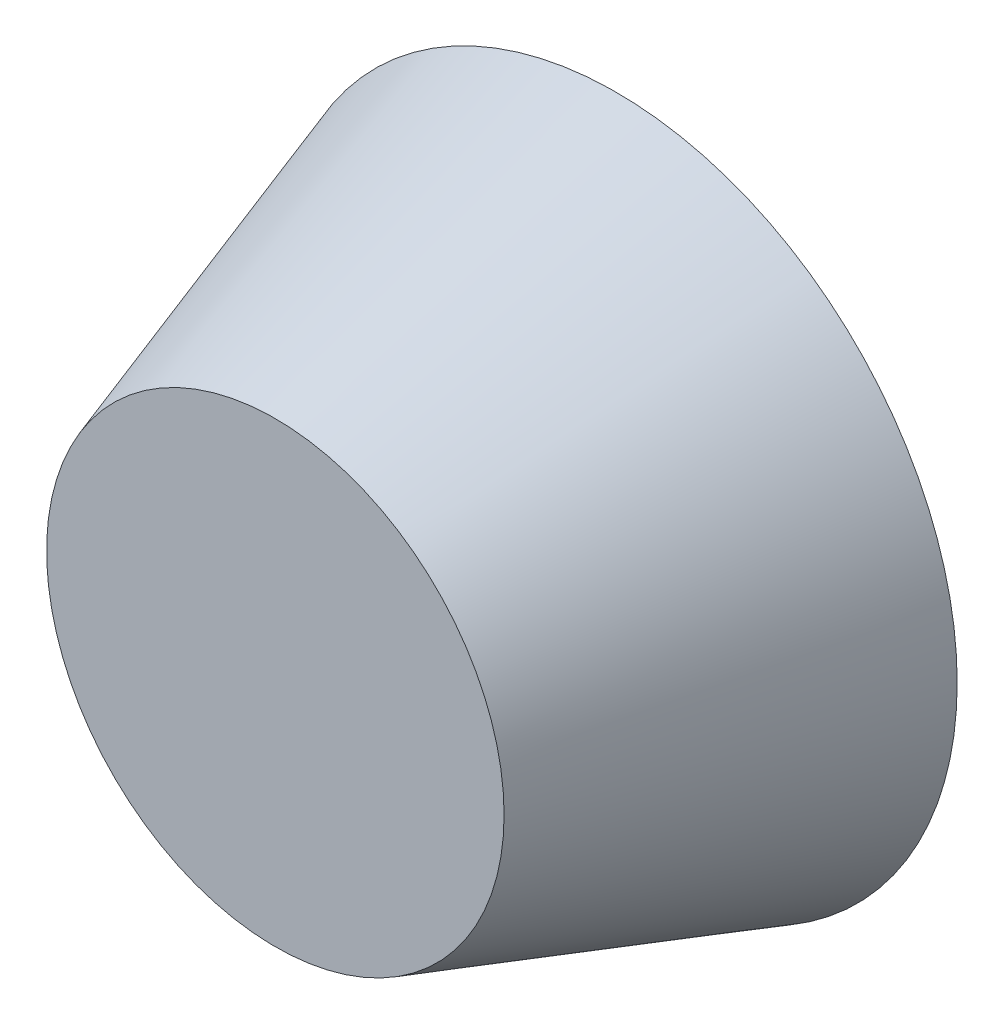
ISO-10303-21;
HEADER;
FILE_DESCRIPTION(('STEP AP214'),'2;1');
FILE_NAME('part.step','',(''),(''),'','','');
FILE_SCHEMA(('AUTOMOTIVE_DESIGN { 1 0 10303 214 1 1 1 1 }'));
ENDSEC;
DATA;
#1=APPLICATION_CONTEXT('core data for automotive mechanical design processes');
#2=APPLICATION_PROTOCOL_DEFINITION('international standard','automotive_design',2000,#1);
#3=PRODUCT_CONTEXT('',#1,'mechanical');
#4=PRODUCT('Part','Part','',(#3));
#5=PRODUCT_RELATED_PRODUCT_CATEGORY('part','',(#4));
#6=PRODUCT_DEFINITION_FORMATION('','',#4);
#7=PRODUCT_DEFINITION_CONTEXT('part definition',#1,'design');
#8=PRODUCT_DEFINITION('design','',#6,#7);
#9=PRODUCT_DEFINITION_SHAPE('','',#8);
#10=(LENGTH_UNIT() NAMED_UNIT(*) SI_UNIT(.MILLI.,.METRE.));
#11=(NAMED_UNIT(*) PLANE_ANGLE_UNIT() SI_UNIT($,.RADIAN.));
#12=(NAMED_UNIT(*) SI_UNIT($,.STERADIAN.) SOLID_ANGLE_UNIT());
#13=UNCERTAINTY_MEASURE_WITH_UNIT(LENGTH_MEASURE(1.E-05),#10,'distance_accuracy_value','');
#14=(GEOMETRIC_REPRESENTATION_CONTEXT(3) GLOBAL_UNCERTAINTY_ASSIGNED_CONTEXT((#13)) GLOBAL_UNIT_ASSIGNED_CONTEXT((#10,
#11,#12)) REPRESENTATION_CONTEXT('',''));
#15=CARTESIAN_POINT('',(0.,0.,0.));
#16=DIRECTION('',(0.,0.,1.));
#17=DIRECTION('',(1.,0.,0.));
#18=AXIS2_PLACEMENT_3D('',#15,#16,#17);
#19=CARTESIAN_POINT('',(0.,0.,5.));
#20=DIRECTION('',(0.,0.,1.));
#21=DIRECTION('',(1.,0.,0.));
#22=AXIS2_PLACEMENT_3D('',#19,#20,#21);
#23=PLANE('',#22);
#24=CARTESIAN_POINT('',(0.,0.,5.));
#25=DIRECTION('',(0.,0.,1.));
#26=DIRECTION('',(1.,0.,0.));
#27=AXIS2_PLACEMENT_3D('',#24,#25,#26);
#28=CIRCLE('',#27,3.35478607297477);
#29=CARTESIAN_POINT('',(3.35478607297477,0.,5.));
#30=VERTEX_POINT('',#29);
#31=EDGE_CURVE('E11',#30,#30,#28,.T.);
#32=ORIENTED_EDGE('',*,*,#31,.T.);
#33=EDGE_LOOP('',(#32));
#34=FACE_BOUND('',#33,.T.);
#35=ADVANCED_FACE('F41',(#34),#23,.T.);
#36=CARTESIAN_POINT('',(0.,0.,0.));
#37=DIRECTION('',(0.,0.,1.));
#38=DIRECTION('',(1.,0.,0.));
#39=AXIS2_PLACEMENT_3D('',#36,#37,#38);
#40=PLANE('',#39);
#41=CARTESIAN_POINT('',(0.,0.,0.));
#42=DIRECTION('',(0.,0.,1.));
#43=DIRECTION('',(1.,0.,0.));
#44=AXIS2_PLACEMENT_3D('',#41,#42,#43);
#45=CIRCLE('',#44,5.);
#46=CARTESIAN_POINT('',(5.,0.,0.));
#47=VERTEX_POINT('',#46);
#48=EDGE_CURVE('E49',#47,#47,#45,.T.);
#49=ORIENTED_EDGE('',*,*,#48,.F.);
#50=EDGE_LOOP('',(#49));
#51=FACE_BOUND('',#50,.T.);
#52=ADVANCED_FACE('F72',(#51),#40,.F.);
#53=CARTESIAN_POINT('',(0.,0.,5.));
#54=DIRECTION('',(0.,0.,-1.));
#55=DIRECTION('',(-1.,0.,0.));
#56=AXIS2_PLACEMENT_3D('',#53,#54,#55);
#57=CONICAL_SURFACE('',#56,3.35478607297477,0.317884103746042);
#58=ORIENTED_EDGE('',*,*,#48,.T.);
#59=EDGE_LOOP('',(#58));
#60=FACE_BOUND('',#59,.T.);
#61=ORIENTED_EDGE('',*,*,#31,.F.);
#62=EDGE_LOOP('',(#61));
#63=FACE_BOUND('',#62,.T.);
#64=ADVANCED_FACE('F80',(#60,#63),#57,.T.);
#65=CLOSED_SHELL('',(#35,#52,#64));
#66=MANIFOLD_SOLID_BREP('B2',#65);
#67=ADVANCED_BREP_SHAPE_REPRESENTATION('',(#18,#66),#14);
#68=SHAPE_DEFINITION_REPRESENTATION(#9,#67);
ENDSEC;
END-ISO-10303-21;
